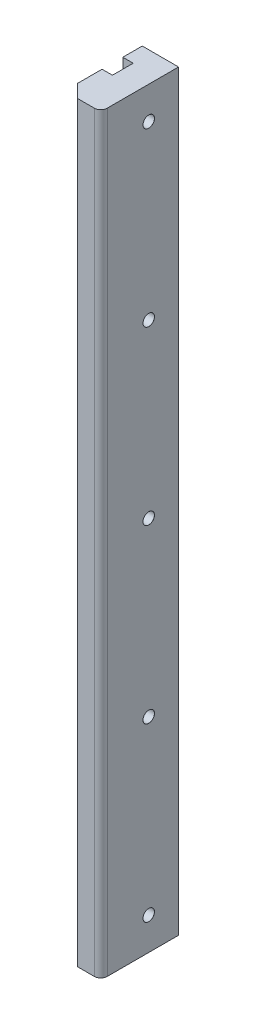
ISO-10303-21;
HEADER;
FILE_DESCRIPTION(('STEP AP214'),'2;1');
FILE_NAME('part.step','',(''),(''),'','','');
FILE_SCHEMA(('AUTOMOTIVE_DESIGN { 1 0 10303 214 1 1 1 1 }'));
ENDSEC;
DATA;
#1=APPLICATION_CONTEXT('core data for automotive mechanical design processes');
#2=APPLICATION_PROTOCOL_DEFINITION('international standard','automotive_design',2000,#1);
#3=PRODUCT_CONTEXT('',#1,'mechanical');
#4=PRODUCT('Part','Part','',(#3));
#5=PRODUCT_RELATED_PRODUCT_CATEGORY('part','',(#4));
#6=PRODUCT_DEFINITION_FORMATION('','',#4);
#7=PRODUCT_DEFINITION_CONTEXT('part definition',#1,'design');
#8=PRODUCT_DEFINITION('design','',#6,#7);
#9=PRODUCT_DEFINITION_SHAPE('','',#8);
#10=(LENGTH_UNIT() NAMED_UNIT(*) SI_UNIT(.MILLI.,.METRE.));
#11=(NAMED_UNIT(*) PLANE_ANGLE_UNIT() SI_UNIT($,.RADIAN.));
#12=(NAMED_UNIT(*) SI_UNIT($,.STERADIAN.) SOLID_ANGLE_UNIT());
#13=UNCERTAINTY_MEASURE_WITH_UNIT(LENGTH_MEASURE(1.E-05),#10,'distance_accuracy_value','');
#14=(GEOMETRIC_REPRESENTATION_CONTEXT(3) GLOBAL_UNCERTAINTY_ASSIGNED_CONTEXT((#13)) GLOBAL_UNIT_ASSIGNED_CONTEXT((#10,
#11,#12)) REPRESENTATION_CONTEXT('',''));
#15=CARTESIAN_POINT('',(0.,0.,0.));
#16=DIRECTION('',(0.,0.,1.));
#17=DIRECTION('',(1.,0.,0.));
#18=AXIS2_PLACEMENT_3D('',#15,#16,#17);
#19=CARTESIAN_POINT('',(-28.,580.,-12.5));
#20=DIRECTION('',(1.,0.,0.));
#21=DIRECTION('',(0.,0.,-1.));
#22=AXIS2_PLACEMENT_3D('',#19,#20,#21);
#23=PLANE('',#22);
#24=DIRECTION('',(0.,0.,1.));
#25=VECTOR('',#24,1.);
#26=CARTESIAN_POINT('',(-28.,0.,-12.5));
#27=LINE('',#26,#25);
#28=CARTESIAN_POINT('',(-28.,0.,-27.5));
#29=VERTEX_POINT('',#28);
#30=CARTESIAN_POINT('',(-28.,0.,-12.5));
#31=VERTEX_POINT('',#30);
#32=EDGE_CURVE('E154',#29,#31,#27,.T.);
#33=ORIENTED_EDGE('',*,*,#32,.T.);
#34=DIRECTION('',(0.,-1.,0.));
#35=VECTOR('',#34,1.);
#36=CARTESIAN_POINT('',(-28.,580.,-12.5));
#37=LINE('',#36,#35);
#38=CARTESIAN_POINT('',(-28.,580.,-12.5));
#39=VERTEX_POINT('',#38);
#40=EDGE_CURVE('E11',#39,#31,#37,.T.);
#41=ORIENTED_EDGE('',*,*,#40,.F.);
#42=DIRECTION('',(0.,0.,1.));
#43=VECTOR('',#42,1.);
#44=CARTESIAN_POINT('',(-28.,580.,-12.5));
#45=LINE('',#44,#43);
#46=CARTESIAN_POINT('',(-28.,580.,-27.5));
#47=VERTEX_POINT('',#46);
#48=EDGE_CURVE('E183',#47,#39,#45,.T.);
#49=ORIENTED_EDGE('',*,*,#48,.F.);
#50=DIRECTION('',(0.,-1.,0.));
#51=VECTOR('',#50,1.);
#52=CARTESIAN_POINT('',(-28.,580.,-27.5));
#53=LINE('',#52,#51);
#54=EDGE_CURVE('E150',#47,#29,#53,.T.);
#55=ORIENTED_EDGE('',*,*,#54,.T.);
#56=EDGE_LOOP('',(#33,#41,#49,#55));
#57=FACE_BOUND('',#56,.T.);
#58=ADVANCED_FACE('F39',(#57),#23,.F.);
#59=CARTESIAN_POINT('',(-20.,580.,-12.5));
#60=DIRECTION('',(0.,0.,-1.));
#61=DIRECTION('',(-1.,0.,0.));
#62=AXIS2_PLACEMENT_3D('',#59,#60,#61);
#63=PLANE('',#62);
#64=DIRECTION('',(1.,0.,0.));
#65=VECTOR('',#64,1.);
#66=CARTESIAN_POINT('',(-20.,0.,-12.5));
#67=LINE('',#66,#65);
#68=CARTESIAN_POINT('',(-20.,0.,-12.5));
#69=VERTEX_POINT('',#68);
#70=EDGE_CURVE('E158',#31,#69,#67,.T.);
#71=ORIENTED_EDGE('',*,*,#70,.T.);
#72=DIRECTION('',(0.,-1.,0.));
#73=VECTOR('',#72,1.);
#74=CARTESIAN_POINT('',(-20.,580.,-12.5));
#75=LINE('',#74,#73);
#76=CARTESIAN_POINT('',(-20.,580.,-12.5));
#77=VERTEX_POINT('',#76);
#78=EDGE_CURVE('E49',#77,#69,#75,.T.);
#79=ORIENTED_EDGE('',*,*,#78,.F.);
#80=DIRECTION('',(1.,0.,0.));
#81=VECTOR('',#80,1.);
#82=CARTESIAN_POINT('',(-20.,580.,-12.5));
#83=LINE('',#82,#81);
#84=EDGE_CURVE('E107',#39,#77,#83,.T.);
#85=ORIENTED_EDGE('',*,*,#84,.F.);
#86=ORIENTED_EDGE('',*,*,#40,.T.);
#87=EDGE_LOOP('',(#71,#79,#85,#86));
#88=FACE_BOUND('',#87,.T.);
#89=ADVANCED_FACE('F305',(#88),#63,.F.);
#90=CARTESIAN_POINT('',(-20.,580.,3.5));
#91=DIRECTION('',(1.,0.,0.));
#92=DIRECTION('',(0.,0.,-1.));
#93=AXIS2_PLACEMENT_3D('',#90,#91,#92);
#94=PLANE('',#93);
#95=CARTESIAN_POINT('',(-20.,25.,-4.5));
#96=DIRECTION('',(1.,0.,0.));
#97=DIRECTION('',(0.,0.,-1.));
#98=AXIS2_PLACEMENT_3D('',#95,#96,#97);
#99=CIRCLE('',#98,4.39999999999999);
#100=CARTESIAN_POINT('',(-20.,25.,-8.89999999999999));
#101=VERTEX_POINT('',#100);
#102=EDGE_CURVE('E42',#101,#101,#99,.T.);
#103=ORIENTED_EDGE('',*,*,#102,.T.);
#104=EDGE_LOOP('',(#103));
#105=FACE_BOUND('',#104,.T.);
#106=CARTESIAN_POINT('',(-20.,157.5,-4.5));
#107=DIRECTION('',(1.,0.,0.));
#108=DIRECTION('',(0.,0.,-1.));
#109=AXIS2_PLACEMENT_3D('',#106,#107,#108);
#110=CIRCLE('',#109,4.39999999999999);
#111=CARTESIAN_POINT('',(-20.,157.5,-8.89999999999999));
#112=VERTEX_POINT('',#111);
#113=EDGE_CURVE('E224',#112,#112,#110,.T.);
#114=ORIENTED_EDGE('',*,*,#113,.T.);
#115=EDGE_LOOP('',(#114));
#116=FACE_BOUND('',#115,.T.);
#117=CARTESIAN_POINT('',(-20.,290.,-4.5));
#118=DIRECTION('',(1.,0.,0.));
#119=DIRECTION('',(0.,0.,-1.));
#120=AXIS2_PLACEMENT_3D('',#117,#118,#119);
#121=CIRCLE('',#120,4.40000000000001);
#122=CARTESIAN_POINT('',(-20.,290.,-8.90000000000002));
#123=VERTEX_POINT('',#122);
#124=EDGE_CURVE('E219',#123,#123,#121,.T.);
#125=ORIENTED_EDGE('',*,*,#124,.T.);
#126=EDGE_LOOP('',(#125));
#127=FACE_BOUND('',#126,.T.);
#128=CARTESIAN_POINT('',(-20.,422.5,-4.5));
#129=DIRECTION('',(1.,0.,0.));
#130=DIRECTION('',(0.,0.,-1.));
#131=AXIS2_PLACEMENT_3D('',#128,#129,#130);
#132=CIRCLE('',#131,4.40000000000001);
#133=CARTESIAN_POINT('',(-20.,422.5,-8.90000000000002));
#134=VERTEX_POINT('',#133);
#135=EDGE_CURVE('E213',#134,#134,#132,.T.);
#136=ORIENTED_EDGE('',*,*,#135,.T.);
#137=EDGE_LOOP('',(#136));
#138=FACE_BOUND('',#137,.T.);
#139=CARTESIAN_POINT('',(-20.,555.,-4.5));
#140=DIRECTION('',(1.,0.,0.));
#141=DIRECTION('',(0.,0.,-1.));
#142=AXIS2_PLACEMENT_3D('',#139,#140,#141);
#143=CIRCLE('',#142,4.39999999999996);
#144=CARTESIAN_POINT('',(-20.,555.,-8.89999999999996));
#145=VERTEX_POINT('',#144);
#146=EDGE_CURVE('E159',#145,#145,#143,.T.);
#147=ORIENTED_EDGE('',*,*,#146,.T.);
#148=EDGE_LOOP('',(#147));
#149=FACE_BOUND('',#148,.T.);
#150=DIRECTION('',(0.,0.,1.));
#151=VECTOR('',#150,1.);
#152=CARTESIAN_POINT('',(-20.,0.,3.5));
#153=LINE('',#152,#151);
#154=CARTESIAN_POINT('',(-20.,0.,3.5));
#155=VERTEX_POINT('',#154);
#156=EDGE_CURVE('E162',#69,#155,#153,.T.);
#157=ORIENTED_EDGE('',*,*,#156,.T.);
#158=DIRECTION('',(0.,-1.,0.));
#159=VECTOR('',#158,1.);
#160=CARTESIAN_POINT('',(-20.,580.,3.5));
#161=LINE('',#160,#159);
#162=CARTESIAN_POINT('',(-20.,580.,3.5));
#163=VERTEX_POINT('',#162);
#164=EDGE_CURVE('E202',#163,#155,#161,.T.);
#165=ORIENTED_EDGE('',*,*,#164,.F.);
#166=DIRECTION('',(0.,0.,1.));
#167=VECTOR('',#166,1.);
#168=CARTESIAN_POINT('',(-20.,580.,3.5));
#169=LINE('',#168,#167);
#170=EDGE_CURVE('E264',#77,#163,#169,.T.);
#171=ORIENTED_EDGE('',*,*,#170,.F.);
#172=ORIENTED_EDGE('',*,*,#78,.T.);
#173=EDGE_LOOP('',(#157,#165,#171,#172));
#174=FACE_BOUND('',#173,.T.);
#175=ADVANCED_FACE('F309',(#105,#116,#127,#138,#149,#174),#94,.F.);
#176=CARTESIAN_POINT('',(-28.,580.,3.5));
#177=DIRECTION('',(0.,0.,1.));
#178=DIRECTION('',(1.,0.,0.));
#179=AXIS2_PLACEMENT_3D('',#176,#177,#178);
#180=PLANE('',#179);
#181=DIRECTION('',(-1.,0.,0.));
#182=VECTOR('',#181,1.);
#183=CARTESIAN_POINT('',(-28.,0.,3.5));
#184=LINE('',#183,#182);
#185=CARTESIAN_POINT('',(-28.,0.,3.5));
#186=VERTEX_POINT('',#185);
#187=EDGE_CURVE('E165',#155,#186,#184,.T.);
#188=ORIENTED_EDGE('',*,*,#187,.T.);
#189=DIRECTION('',(0.,-1.,0.));
#190=VECTOR('',#189,1.);
#191=CARTESIAN_POINT('',(-28.,580.,3.5));
#192=LINE('',#191,#190);
#193=CARTESIAN_POINT('',(-28.,580.,3.5));
#194=VERTEX_POINT('',#193);
#195=EDGE_CURVE('E198',#194,#186,#192,.T.);
#196=ORIENTED_EDGE('',*,*,#195,.F.);
#197=DIRECTION('',(-1.,0.,0.));
#198=VECTOR('',#197,1.);
#199=CARTESIAN_POINT('',(-28.,580.,3.5));
#200=LINE('',#199,#198);
#201=EDGE_CURVE('E267',#163,#194,#200,.T.);
#202=ORIENTED_EDGE('',*,*,#201,.F.);
#203=ORIENTED_EDGE('',*,*,#164,.T.);
#204=EDGE_LOOP('',(#188,#196,#202,#203));
#205=FACE_BOUND('',#204,.T.);
#206=ADVANCED_FACE('F313',(#205),#180,.F.);
#207=CARTESIAN_POINT('',(-28.,580.,22.5));
#208=DIRECTION('',(1.,0.,0.));
#209=DIRECTION('',(0.,0.,-1.));
#210=AXIS2_PLACEMENT_3D('',#207,#208,#209);
#211=PLANE('',#210);
#212=DIRECTION('',(0.,0.,1.));
#213=VECTOR('',#212,1.);
#214=CARTESIAN_POINT('',(-28.,0.,22.5));
#215=LINE('',#214,#213);
#216=CARTESIAN_POINT('',(-28.,0.,22.5));
#217=VERTEX_POINT('',#216);
#218=EDGE_CURVE('E168',#186,#217,#215,.T.);
#219=ORIENTED_EDGE('',*,*,#218,.T.);
#220=DIRECTION('',(0.,-1.,0.));
#221=VECTOR('',#220,1.);
#222=CARTESIAN_POINT('',(-28.,580.,22.5));
#223=LINE('',#222,#221);
#224=CARTESIAN_POINT('',(-28.,580.,22.5));
#225=VERTEX_POINT('',#224);
#226=EDGE_CURVE('E194',#225,#217,#223,.T.);
#227=ORIENTED_EDGE('',*,*,#226,.F.);
#228=DIRECTION('',(0.,0.,1.));
#229=VECTOR('',#228,1.);
#230=CARTESIAN_POINT('',(-28.,580.,22.5));
#231=LINE('',#230,#229);
#232=EDGE_CURVE('E270',#194,#225,#231,.T.);
#233=ORIENTED_EDGE('',*,*,#232,.F.);
#234=ORIENTED_EDGE('',*,*,#195,.T.);
#235=EDGE_LOOP('',(#219,#227,#233,#234));
#236=FACE_BOUND('',#235,.T.);
#237=ADVANCED_FACE('F319',(#236),#211,.F.);
#238=CARTESIAN_POINT('',(-18.,580.,32.5));
#239=DIRECTION('',(0.707106781186548,0.,-0.707106781186548));
#240=DIRECTION('',(-0.707106781186548,0.,-0.707106781186548));
#241=AXIS2_PLACEMENT_3D('',#238,#239,#240);
#242=PLANE('',#241);
#243=DIRECTION('',(0.707106781186548,0.,0.707106781186548));
#244=VECTOR('',#243,1.);
#245=CARTESIAN_POINT('',(-18.,0.,32.5));
#246=LINE('',#245,#244);
#247=CARTESIAN_POINT('',(-18.,0.,32.5));
#248=VERTEX_POINT('',#247);
#249=EDGE_CURVE('E171',#217,#248,#246,.T.);
#250=ORIENTED_EDGE('',*,*,#249,.T.);
#251=DIRECTION('',(0.,-1.,0.));
#252=VECTOR('',#251,1.);
#253=CARTESIAN_POINT('',(-18.,580.,32.5));
#254=LINE('',#253,#252);
#255=CARTESIAN_POINT('',(-18.,580.,32.5));
#256=VERTEX_POINT('',#255);
#257=EDGE_CURVE('E190',#256,#248,#254,.T.);
#258=ORIENTED_EDGE('',*,*,#257,.F.);
#259=DIRECTION('',(0.707106781186548,0.,0.707106781186548));
#260=VECTOR('',#259,1.);
#261=CARTESIAN_POINT('',(-18.,580.,32.5));
#262=LINE('',#261,#260);
#263=EDGE_CURVE('E273',#225,#256,#262,.T.);
#264=ORIENTED_EDGE('',*,*,#263,.F.);
#265=ORIENTED_EDGE('',*,*,#226,.T.);
#266=EDGE_LOOP('',(#250,#258,#264,#265));
#267=FACE_BOUND('',#266,.T.);
#268=ADVANCED_FACE('F281',(#267),#242,.F.);
#269=CARTESIAN_POINT('',(-5.,580.,32.5));
#270=DIRECTION('',(0.,0.,-1.));
#271=DIRECTION('',(-1.,0.,0.));
#272=AXIS2_PLACEMENT_3D('',#269,#270,#271);
#273=PLANE('',#272);
#274=DIRECTION('',(1.,0.,0.));
#275=VECTOR('',#274,1.);
#276=CARTESIAN_POINT('',(-5.,0.,32.5));
#277=LINE('',#276,#275);
#278=CARTESIAN_POINT('',(-5.,0.,32.5));
#279=VERTEX_POINT('',#278);
#280=EDGE_CURVE('E174',#248,#279,#277,.T.);
#281=ORIENTED_EDGE('',*,*,#280,.T.);
#282=DIRECTION('',(0.,-1.,0.));
#283=VECTOR('',#282,1.);
#284=CARTESIAN_POINT('',(-5.,580.,32.5));
#285=LINE('',#284,#283);
#286=CARTESIAN_POINT('',(-5.,580.,32.5));
#287=VERTEX_POINT('',#286);
#288=EDGE_CURVE('E143',#287,#279,#285,.T.);
#289=ORIENTED_EDGE('',*,*,#288,.F.);
#290=DIRECTION('',(1.,0.,0.));
#291=VECTOR('',#290,1.);
#292=CARTESIAN_POINT('',(-5.,580.,32.5));
#293=LINE('',#292,#291);
#294=EDGE_CURVE('E132',#256,#287,#293,.T.);
#295=ORIENTED_EDGE('',*,*,#294,.F.);
#296=ORIENTED_EDGE('',*,*,#257,.T.);
#297=EDGE_LOOP('',(#281,#289,#295,#296));
#298=FACE_BOUND('',#297,.T.);
#299=ADVANCED_FACE('F285',(#298),#273,.F.);
#300=CARTESIAN_POINT('',(-5.,580.,27.5));
#301=DIRECTION('',(0.,-1.,0.));
#302=DIRECTION('',(0.,0.,-1.));
#303=AXIS2_PLACEMENT_3D('',#300,#301,#302);
#304=CYLINDRICAL_SURFACE('',#303,5.);
#305=CARTESIAN_POINT('',(-5.,0.,27.5));
#306=DIRECTION('',(0.,1.,0.));
#307=DIRECTION('',(0.,0.,-1.));
#308=AXIS2_PLACEMENT_3D('',#305,#306,#307);
#309=CIRCLE('',#308,5.);
#310=CARTESIAN_POINT('',(0.,0.,27.5));
#311=VERTEX_POINT('',#310);
#312=EDGE_CURVE('E141',#279,#311,#309,.T.);
#313=ORIENTED_EDGE('',*,*,#312,.T.);
#314=DIRECTION('',(0.,-1.,0.));
#315=VECTOR('',#314,1.);
#316=CARTESIAN_POINT('',(0.,580.,27.5));
#317=LINE('',#316,#315);
#318=CARTESIAN_POINT('',(0.,580.,27.5));
#319=VERTEX_POINT('',#318);
#320=EDGE_CURVE('E138',#319,#311,#317,.T.);
#321=ORIENTED_EDGE('',*,*,#320,.F.);
#322=CARTESIAN_POINT('',(-5.,580.,27.5));
#323=DIRECTION('',(0.,1.,0.));
#324=DIRECTION('',(0.,0.,-1.));
#325=AXIS2_PLACEMENT_3D('',#322,#323,#324);
#326=CIRCLE('',#325,5.);
#327=EDGE_CURVE('E126',#287,#319,#326,.T.);
#328=ORIENTED_EDGE('',*,*,#327,.F.);
#329=ORIENTED_EDGE('',*,*,#288,.T.);
#330=EDGE_LOOP('',(#313,#321,#328,#329));
#331=FACE_BOUND('',#330,.T.);
#332=ADVANCED_FACE('F139',(#331),#304,.T.);
#333=CARTESIAN_POINT('',(0.,580.,-27.5));
#334=DIRECTION('',(-1.,0.,0.));
#335=DIRECTION('',(0.,0.,1.));
#336=AXIS2_PLACEMENT_3D('',#333,#334,#335);
#337=PLANE('',#336);
#338=CARTESIAN_POINT('',(0.,25.,-4.5));
#339=DIRECTION('',(1.,0.,0.));
#340=DIRECTION('',(0.,0.,-1.));
#341=AXIS2_PLACEMENT_3D('',#338,#339,#340);
#342=CIRCLE('',#341,4.425);
#343=CARTESIAN_POINT('',(0.,25.,-8.925));
#344=VERTEX_POINT('',#343);
#345=EDGE_CURVE('E466',#344,#344,#342,.T.);
#346=ORIENTED_EDGE('',*,*,#345,.F.);
#347=EDGE_LOOP('',(#346));
#348=FACE_BOUND('',#347,.T.);
#349=CARTESIAN_POINT('',(0.,157.5,-4.5));
#350=DIRECTION('',(1.,0.,0.));
#351=DIRECTION('',(0.,0.,-1.));
#352=AXIS2_PLACEMENT_3D('',#349,#350,#351);
#353=CIRCLE('',#352,4.42500000000001);
#354=CARTESIAN_POINT('',(0.,157.5,-8.92500000000001));
#355=VERTEX_POINT('',#354);
#356=EDGE_CURVE('E236',#355,#355,#353,.T.);
#357=ORIENTED_EDGE('',*,*,#356,.F.);
#358=EDGE_LOOP('',(#357));
#359=FACE_BOUND('',#358,.T.);
#360=CARTESIAN_POINT('',(0.,290.,-4.5));
#361=DIRECTION('',(1.,0.,0.));
#362=DIRECTION('',(0.,0.,-1.));
#363=AXIS2_PLACEMENT_3D('',#360,#361,#362);
#364=CIRCLE('',#363,4.42500000000001);
#365=CARTESIAN_POINT('',(0.,290.,-8.92500000000001));
#366=VERTEX_POINT('',#365);
#367=EDGE_CURVE('E227',#366,#366,#364,.T.);
#368=ORIENTED_EDGE('',*,*,#367,.F.);
#369=EDGE_LOOP('',(#368));
#370=FACE_BOUND('',#369,.T.);
#371=CARTESIAN_POINT('',(0.,422.5,-4.5));
#372=DIRECTION('',(1.,0.,0.));
#373=DIRECTION('',(0.,0.,-1.));
#374=AXIS2_PLACEMENT_3D('',#371,#372,#373);
#375=CIRCLE('',#374,4.42500000000001);
#376=CARTESIAN_POINT('',(0.,422.5,-8.92500000000001));
#377=VERTEX_POINT('',#376);
#378=EDGE_CURVE('E222',#377,#377,#375,.T.);
#379=ORIENTED_EDGE('',*,*,#378,.F.);
#380=EDGE_LOOP('',(#379));
#381=FACE_BOUND('',#380,.T.);
#382=CARTESIAN_POINT('',(0.,555.,-4.5));
#383=DIRECTION('',(1.,0.,0.));
#384=DIRECTION('',(0.,0.,-1.));
#385=AXIS2_PLACEMENT_3D('',#382,#383,#384);
#386=CIRCLE('',#385,4.42500000000001);
#387=CARTESIAN_POINT('',(0.,555.,-8.92500000000001));
#388=VERTEX_POINT('',#387);
#389=EDGE_CURVE('E217',#388,#388,#386,.T.);
#390=ORIENTED_EDGE('',*,*,#389,.F.);
#391=EDGE_LOOP('',(#390));
#392=FACE_BOUND('',#391,.T.);
#393=DIRECTION('',(0.,0.,-1.));
#394=VECTOR('',#393,1.);
#395=CARTESIAN_POINT('',(0.,0.,-27.5));
#396=LINE('',#395,#394);
#397=CARTESIAN_POINT('',(0.,0.,-27.5));
#398=VERTEX_POINT('',#397);
#399=EDGE_CURVE('E93',#311,#398,#396,.T.);
#400=ORIENTED_EDGE('',*,*,#399,.T.);
#401=DIRECTION('',(0.,-1.,0.));
#402=VECTOR('',#401,1.);
#403=CARTESIAN_POINT('',(0.,580.,-27.5));
#404=LINE('',#403,#402);
#405=CARTESIAN_POINT('',(0.,580.,-27.5));
#406=VERTEX_POINT('',#405);
#407=EDGE_CURVE('E144',#406,#398,#404,.T.);
#408=ORIENTED_EDGE('',*,*,#407,.F.);
#409=DIRECTION('',(0.,0.,-1.));
#410=VECTOR('',#409,1.);
#411=CARTESIAN_POINT('',(0.,580.,-27.5));
#412=LINE('',#411,#410);
#413=EDGE_CURVE('E130',#319,#406,#412,.T.);
#414=ORIENTED_EDGE('',*,*,#413,.F.);
#415=ORIENTED_EDGE('',*,*,#320,.T.);
#416=EDGE_LOOP('',(#400,#408,#414,#415));
#417=FACE_BOUND('',#416,.T.);
#418=ADVANCED_FACE('F146',(#348,#359,#370,#381,#392,#417),#337,.F.);
#419=CARTESIAN_POINT('',(-28.,580.,-27.5));
#420=DIRECTION('',(0.,0.,1.));
#421=DIRECTION('',(1.,0.,0.));
#422=AXIS2_PLACEMENT_3D('',#419,#420,#421);
#423=PLANE('',#422);
#424=DIRECTION('',(-1.,0.,0.));
#425=VECTOR('',#424,1.);
#426=CARTESIAN_POINT('',(-28.,0.,-27.5));
#427=LINE('',#426,#425);
#428=EDGE_CURVE('E99',#398,#29,#427,.T.);
#429=ORIENTED_EDGE('',*,*,#428,.T.);
#430=ORIENTED_EDGE('',*,*,#54,.F.);
#431=DIRECTION('',(-1.,0.,0.));
#432=VECTOR('',#431,1.);
#433=CARTESIAN_POINT('',(-28.,580.,-27.5));
#434=LINE('',#433,#432);
#435=EDGE_CURVE('E58',#406,#47,#434,.T.);
#436=ORIENTED_EDGE('',*,*,#435,.F.);
#437=ORIENTED_EDGE('',*,*,#407,.T.);
#438=EDGE_LOOP('',(#429,#430,#436,#437));
#439=FACE_BOUND('',#438,.T.);
#440=ADVANCED_FACE('F293',(#439),#423,.F.);
#441=CARTESIAN_POINT('',(-5.,580.,27.5));
#442=DIRECTION('',(0.,-1.,0.));
#443=DIRECTION('',(0.,0.,-1.));
#444=AXIS2_PLACEMENT_3D('',#441,#442,#443);
#445=PLANE('',#444);
#446=ORIENTED_EDGE('',*,*,#48,.T.);
#447=ORIENTED_EDGE('',*,*,#84,.T.);
#448=ORIENTED_EDGE('',*,*,#170,.T.);
#449=ORIENTED_EDGE('',*,*,#201,.T.);
#450=ORIENTED_EDGE('',*,*,#232,.T.);
#451=ORIENTED_EDGE('',*,*,#263,.T.);
#452=ORIENTED_EDGE('',*,*,#294,.T.);
#453=ORIENTED_EDGE('',*,*,#327,.T.);
#454=ORIENTED_EDGE('',*,*,#413,.T.);
#455=ORIENTED_EDGE('',*,*,#435,.T.);
#456=EDGE_LOOP('',(#446,#447,#448,#449,#450,#451,#452,#453,#454,#455));
#457=FACE_BOUND('',#456,.T.);
#458=ADVANCED_FACE('F128',(#457),#445,.F.);
#459=CARTESIAN_POINT('',(-5.,0.,27.5));
#460=DIRECTION('',(0.,-1.,0.));
#461=DIRECTION('',(0.,0.,-1.));
#462=AXIS2_PLACEMENT_3D('',#459,#460,#461);
#463=PLANE('',#462);
#464=ORIENTED_EDGE('',*,*,#32,.F.);
#465=ORIENTED_EDGE('',*,*,#428,.F.);
#466=ORIENTED_EDGE('',*,*,#399,.F.);
#467=ORIENTED_EDGE('',*,*,#312,.F.);
#468=ORIENTED_EDGE('',*,*,#280,.F.);
#469=ORIENTED_EDGE('',*,*,#249,.F.);
#470=ORIENTED_EDGE('',*,*,#218,.F.);
#471=ORIENTED_EDGE('',*,*,#187,.F.);
#472=ORIENTED_EDGE('',*,*,#156,.F.);
#473=ORIENTED_EDGE('',*,*,#70,.F.);
#474=EDGE_LOOP('',(#464,#465,#466,#467,#468,#469,#470,#471,#472,#473));
#475=FACE_BOUND('',#474,.T.);
#476=ADVANCED_FACE('F288',(#475),#463,.T.);
#477=CARTESIAN_POINT('',(0.,555.,-4.5));
#478=DIRECTION('',(1.,0.,0.));
#479=DIRECTION('',(0.,0.,-1.));
#480=AXIS2_PLACEMENT_3D('',#477,#478,#479);
#481=CYLINDRICAL_SURFACE('',#480,4.39999999999996);
#482=CARTESIAN_POINT('',(-0.0250000000000111,555.,-4.5));
#483=DIRECTION('',(1.,0.,0.));
#484=DIRECTION('',(0.,0.,-1.));
#485=AXIS2_PLACEMENT_3D('',#482,#483,#484);
#486=CIRCLE('',#485,4.39999999999996);
#487=CARTESIAN_POINT('',(-0.0250000000000111,555.,-8.89999999999996));
#488=VERTEX_POINT('',#487);
#489=EDGE_CURVE('E212',#488,#488,#486,.T.);
#490=ORIENTED_EDGE('',*,*,#489,.T.);
#491=EDGE_LOOP('',(#490));
#492=FACE_BOUND('',#491,.T.);
#493=ORIENTED_EDGE('',*,*,#146,.F.);
#494=EDGE_LOOP('',(#493));
#495=FACE_BOUND('',#494,.T.);
#496=ADVANCED_FACE('F347',(#492,#495),#481,.F.);
#497=CARTESIAN_POINT('',(0.,555.,-4.5));
#498=DIRECTION('',(1.,0.,0.));
#499=DIRECTION('',(0.,0.,-1.));
#500=AXIS2_PLACEMENT_3D('',#497,#498,#499);
#501=CONICAL_SURFACE('',#500,4.42500000000001,0.785398163398246);
#502=ORIENTED_EDGE('',*,*,#489,.F.);
#503=EDGE_LOOP('',(#502));
#504=FACE_BOUND('',#503,.T.);
#505=ORIENTED_EDGE('',*,*,#389,.T.);
#506=EDGE_LOOP('',(#505));
#507=FACE_BOUND('',#506,.T.);
#508=ADVANCED_FACE('F352',(#504,#507),#501,.F.);
#509=CARTESIAN_POINT('',(0.,422.5,-4.5));
#510=DIRECTION('',(1.,0.,0.));
#511=DIRECTION('',(0.,0.,-1.));
#512=AXIS2_PLACEMENT_3D('',#509,#510,#511);
#513=CYLINDRICAL_SURFACE('',#512,4.40000000000001);
#514=CARTESIAN_POINT('',(-0.0250000000000111,422.5,-4.5));
#515=DIRECTION('',(1.,0.,0.));
#516=DIRECTION('',(0.,0.,-1.));
#517=AXIS2_PLACEMENT_3D('',#514,#515,#516);
#518=CIRCLE('',#517,4.40000000000001);
#519=CARTESIAN_POINT('',(-0.0250000000000111,422.5,-8.90000000000002));
#520=VERTEX_POINT('',#519);
#521=EDGE_CURVE('E218',#520,#520,#518,.T.);
#522=ORIENTED_EDGE('',*,*,#521,.T.);
#523=EDGE_LOOP('',(#522));
#524=FACE_BOUND('',#523,.T.);
#525=ORIENTED_EDGE('',*,*,#135,.F.);
#526=EDGE_LOOP('',(#525));
#527=FACE_BOUND('',#526,.T.);
#528=ADVANCED_FACE('F364',(#524,#527),#513,.F.);
#529=CARTESIAN_POINT('',(0.,422.5,-4.5));
#530=DIRECTION('',(1.,0.,0.));
#531=DIRECTION('',(0.,0.,-1.));
#532=AXIS2_PLACEMENT_3D('',#529,#530,#531);
#533=CONICAL_SURFACE('',#532,4.42500000000001,0.785398163397136);
#534=ORIENTED_EDGE('',*,*,#521,.F.);
#535=EDGE_LOOP('',(#534));
#536=FACE_BOUND('',#535,.T.);
#537=ORIENTED_EDGE('',*,*,#378,.T.);
#538=EDGE_LOOP('',(#537));
#539=FACE_BOUND('',#538,.T.);
#540=ADVANCED_FACE('F374',(#536,#539),#533,.F.);
#541=CARTESIAN_POINT('',(0.,290.,-4.5));
#542=DIRECTION('',(1.,0.,0.));
#543=DIRECTION('',(0.,0.,-1.));
#544=AXIS2_PLACEMENT_3D('',#541,#542,#543);
#545=CYLINDRICAL_SURFACE('',#544,4.40000000000001);
#546=CARTESIAN_POINT('',(-0.0250000000000111,290.,-4.5));
#547=DIRECTION('',(1.,0.,0.));
#548=DIRECTION('',(0.,0.,-1.));
#549=AXIS2_PLACEMENT_3D('',#546,#547,#548);
#550=CIRCLE('',#549,4.40000000000001);
#551=CARTESIAN_POINT('',(-0.0250000000000111,290.,-8.90000000000002));
#552=VERTEX_POINT('',#551);
#553=EDGE_CURVE('E223',#552,#552,#550,.T.);
#554=ORIENTED_EDGE('',*,*,#553,.T.);
#555=EDGE_LOOP('',(#554));
#556=FACE_BOUND('',#555,.T.);
#557=ORIENTED_EDGE('',*,*,#124,.F.);
#558=EDGE_LOOP('',(#557));
#559=FACE_BOUND('',#558,.T.);
#560=ADVANCED_FACE('F384',(#556,#559),#545,.F.);
#561=CARTESIAN_POINT('',(0.,290.,-4.5));
#562=DIRECTION('',(1.,0.,0.));
#563=DIRECTION('',(0.,0.,-1.));
#564=AXIS2_PLACEMENT_3D('',#561,#562,#563);
#565=CONICAL_SURFACE('',#564,4.42500000000001,0.785398163397136);
#566=ORIENTED_EDGE('',*,*,#553,.F.);
#567=EDGE_LOOP('',(#566));
#568=FACE_BOUND('',#567,.T.);
#569=ORIENTED_EDGE('',*,*,#367,.T.);
#570=EDGE_LOOP('',(#569));
#571=FACE_BOUND('',#570,.T.);
#572=ADVANCED_FACE('F394',(#568,#571),#565,.F.);
#573=CARTESIAN_POINT('',(0.,157.5,-4.5));
#574=DIRECTION('',(1.,0.,0.));
#575=DIRECTION('',(0.,0.,-1.));
#576=AXIS2_PLACEMENT_3D('',#573,#574,#575);
#577=CYLINDRICAL_SURFACE('',#576,4.39999999999999);
#578=CARTESIAN_POINT('',(-0.0250000000000111,157.5,-4.5));
#579=DIRECTION('',(1.,0.,0.));
#580=DIRECTION('',(0.,0.,-1.));
#581=AXIS2_PLACEMENT_3D('',#578,#579,#580);
#582=CIRCLE('',#581,4.39999999999999);
#583=CARTESIAN_POINT('',(-0.0250000000000111,157.5,-8.89999999999999));
#584=VERTEX_POINT('',#583);
#585=EDGE_CURVE('E228',#584,#584,#582,.T.);
#586=ORIENTED_EDGE('',*,*,#585,.T.);
#587=EDGE_LOOP('',(#586));
#588=FACE_BOUND('',#587,.T.);
#589=ORIENTED_EDGE('',*,*,#113,.F.);
#590=EDGE_LOOP('',(#589));
#591=FACE_BOUND('',#590,.T.);
#592=ADVANCED_FACE('F404',(#588,#591),#577,.F.);
#593=CARTESIAN_POINT('',(0.,157.5,-4.5));
#594=DIRECTION('',(1.,0.,0.));
#595=DIRECTION('',(0.,0.,-1.));
#596=AXIS2_PLACEMENT_3D('',#593,#594,#595);
#597=CONICAL_SURFACE('',#596,4.42500000000001,0.785398163397691);
#598=ORIENTED_EDGE('',*,*,#585,.F.);
#599=EDGE_LOOP('',(#598));
#600=FACE_BOUND('',#599,.T.);
#601=ORIENTED_EDGE('',*,*,#356,.T.);
#602=EDGE_LOOP('',(#601));
#603=FACE_BOUND('',#602,.T.);
#604=ADVANCED_FACE('F414',(#600,#603),#597,.F.);
#605=CARTESIAN_POINT('',(0.,25.,-4.5));
#606=DIRECTION('',(1.,0.,0.));
#607=DIRECTION('',(0.,0.,-1.));
#608=AXIS2_PLACEMENT_3D('',#605,#606,#607);
#609=CYLINDRICAL_SURFACE('',#608,4.39999999999999);
#610=CARTESIAN_POINT('',(-0.0250000000000111,25.,-4.5));
#611=DIRECTION('',(1.,0.,0.));
#612=DIRECTION('',(0.,0.,-1.));
#613=AXIS2_PLACEMENT_3D('',#610,#611,#612);
#614=CIRCLE('',#613,4.39999999999999);
#615=CARTESIAN_POINT('',(-0.0250000000000111,25.,-8.9));
#616=VERTEX_POINT('',#615);
#617=EDGE_CURVE('E463',#616,#616,#614,.T.);
#618=ORIENTED_EDGE('',*,*,#617,.T.);
#619=EDGE_LOOP('',(#618));
#620=FACE_BOUND('',#619,.T.);
#621=ORIENTED_EDGE('',*,*,#102,.F.);
#622=EDGE_LOOP('',(#621));
#623=FACE_BOUND('',#622,.T.);
#624=ADVANCED_FACE('F423',(#620,#623),#609,.F.);
#625=CARTESIAN_POINT('',(0.,25.,-4.5));
#626=DIRECTION('',(1.,0.,0.));
#627=DIRECTION('',(0.,0.,-1.));
#628=AXIS2_PLACEMENT_3D('',#625,#626,#627);
#629=CONICAL_SURFACE('',#628,4.425,0.785398163397275);
#630=ORIENTED_EDGE('',*,*,#617,.F.);
#631=EDGE_LOOP('',(#630));
#632=FACE_BOUND('',#631,.T.);
#633=ORIENTED_EDGE('',*,*,#345,.T.);
#634=EDGE_LOOP('',(#633));
#635=FACE_BOUND('',#634,.T.);
#636=ADVANCED_FACE('F433',(#632,#635),#629,.F.);
#637=CLOSED_SHELL('',(#58,#89,#175,#206,#237,#268,#299,#332,#418,#440,#458,#476,#496,#508,#528,
#540,#560,#572,#592,#604,#624,#636));
#638=MANIFOLD_SOLID_BREP('B2',#637);
#639=ADVANCED_BREP_SHAPE_REPRESENTATION('',(#18,#638),#14);
#640=SHAPE_DEFINITION_REPRESENTATION(#9,#639);
ENDSEC;
END-ISO-10303-21;
